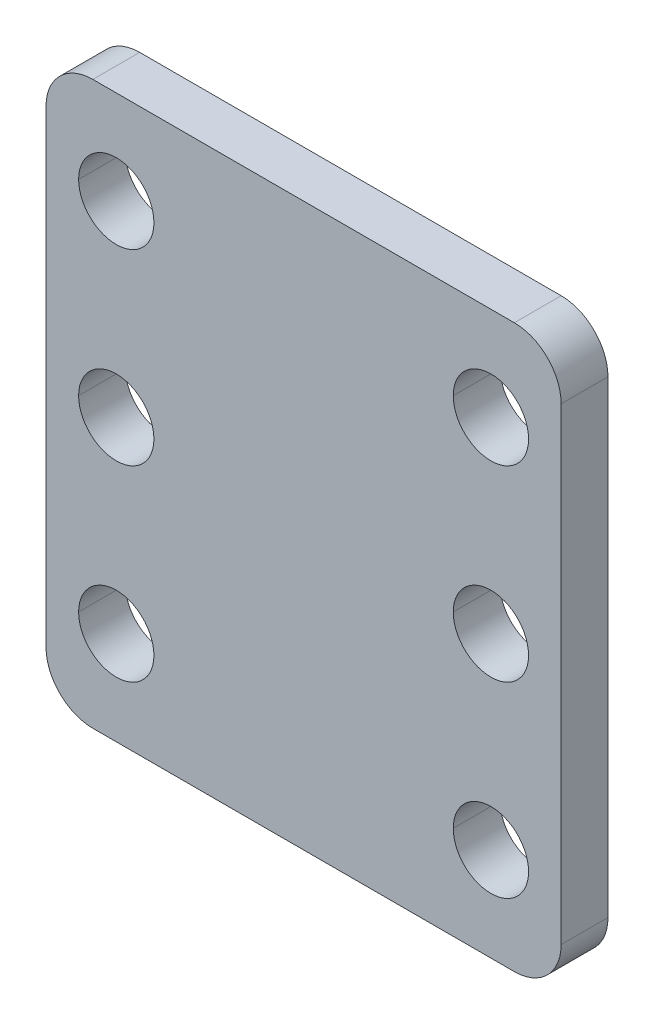
ISO-10303-21;
HEADER;
FILE_DESCRIPTION(('STEP AP214'),'2;1');
FILE_NAME('part.step','',(''),(''),'','','');
FILE_SCHEMA(('AUTOMOTIVE_DESIGN { 1 0 10303 214 1 1 1 1 }'));
ENDSEC;
DATA;
#1=APPLICATION_CONTEXT('core data for automotive mechanical design processes');
#2=APPLICATION_PROTOCOL_DEFINITION('international standard','automotive_design',2000,#1);
#3=PRODUCT_CONTEXT('',#1,'mechanical');
#4=PRODUCT('Part','Part','',(#3));
#5=PRODUCT_RELATED_PRODUCT_CATEGORY('part','',(#4));
#6=PRODUCT_DEFINITION_FORMATION('','',#4);
#7=PRODUCT_DEFINITION_CONTEXT('part definition',#1,'design');
#8=PRODUCT_DEFINITION('design','',#6,#7);
#9=PRODUCT_DEFINITION_SHAPE('','',#8);
#10=(LENGTH_UNIT() NAMED_UNIT(*) SI_UNIT(.MILLI.,.METRE.));
#11=(NAMED_UNIT(*) PLANE_ANGLE_UNIT() SI_UNIT($,.RADIAN.));
#12=(NAMED_UNIT(*) SI_UNIT($,.STERADIAN.) SOLID_ANGLE_UNIT());
#13=UNCERTAINTY_MEASURE_WITH_UNIT(LENGTH_MEASURE(1.E-05),#10,'distance_accuracy_value','');
#14=(GEOMETRIC_REPRESENTATION_CONTEXT(3) GLOBAL_UNCERTAINTY_ASSIGNED_CONTEXT((#13)) GLOBAL_UNIT_ASSIGNED_CONTEXT((#10,
#11,#12)) REPRESENTATION_CONTEXT('',''));
#15=CARTESIAN_POINT('',(0.,0.,0.));
#16=DIRECTION('',(0.,0.,1.));
#17=DIRECTION('',(1.,0.,0.));
#18=AXIS2_PLACEMENT_3D('',#15,#16,#17);
#19=CARTESIAN_POINT('',(114.299999999998,1193.8,-69.849999999999));
#20=DIRECTION('',(0.,0.,1.));
#21=DIRECTION('',(1.,0.,0.));
#22=AXIS2_PLACEMENT_3D('',#19,#20,#21);
#23=CYLINDRICAL_SURFACE('',#22,2.5527);
#24=CARTESIAN_POINT('',(114.299999999998,1193.8,-73.024999999999));
#25=DIRECTION('',(0.,0.,1.));
#26=DIRECTION('',(1.,0.,0.));
#27=AXIS2_PLACEMENT_3D('',#24,#25,#26);
#28=CIRCLE('',#27,2.5527);
#29=CARTESIAN_POINT('',(111.747299999998,1193.8,-73.024999999999));
#30=VERTEX_POINT('',#29);
#31=CARTESIAN_POINT('',(116.852699999998,1193.8,-73.024999999999));
#32=VERTEX_POINT('',#31);
#33=EDGE_CURVE('E208',#30,#32,#28,.F.);
#34=ORIENTED_EDGE('',*,*,#33,.F.);
#35=DIRECTION('',(0.,0.,1.));
#36=VECTOR('',#35,1.);
#37=CARTESIAN_POINT('',(111.747299999998,1193.8,-69.849999999999));
#38=LINE('',#37,#36);
#39=CARTESIAN_POINT('',(111.747299999998,1193.8,-76.199999999999));
#40=VERTEX_POINT('',#39);
#41=EDGE_CURVE('E215',#40,#30,#38,.T.);
#42=ORIENTED_EDGE('',*,*,#41,.F.);
#43=CARTESIAN_POINT('',(114.299999999998,1193.8,-76.199999999999));
#44=DIRECTION('',(0.,0.,1.));
#45=DIRECTION('',(1.,0.,0.));
#46=AXIS2_PLACEMENT_3D('',#43,#44,#45);
#47=CIRCLE('',#46,2.5527);
#48=CARTESIAN_POINT('',(116.852699999998,1193.8,-76.199999999999));
#49=VERTEX_POINT('',#48);
#50=EDGE_CURVE('E256',#49,#40,#47,.T.);
#51=ORIENTED_EDGE('',*,*,#50,.F.);
#52=DIRECTION('',(0.,0.,1.));
#53=VECTOR('',#52,1.);
#54=CARTESIAN_POINT('',(116.852699999998,1193.8,-69.849999999999));
#55=LINE('',#54,#53);
#56=EDGE_CURVE('E217',#49,#32,#55,.T.);
#57=ORIENTED_EDGE('',*,*,#56,.T.);
#58=EDGE_LOOP('',(#34,#42,#51,#57));
#59=FACE_BOUND('',#58,.T.);
#60=ADVANCED_FACE('F50',(#59),#23,.F.);
#61=CARTESIAN_POINT('',(114.299999999998,1168.4,-69.849999999999));
#62=DIRECTION('',(0.,0.,1.));
#63=DIRECTION('',(1.,0.,0.));
#64=AXIS2_PLACEMENT_3D('',#61,#62,#63);
#65=CYLINDRICAL_SURFACE('',#64,2.5527);
#66=CARTESIAN_POINT('',(114.299999999998,1168.4,-73.024999999999));
#67=DIRECTION('',(0.,0.,1.));
#68=DIRECTION('',(1.,0.,0.));
#69=AXIS2_PLACEMENT_3D('',#66,#67,#68);
#70=CIRCLE('',#69,2.5527);
#71=CARTESIAN_POINT('',(111.747299999998,1168.4,-73.024999999999));
#72=VERTEX_POINT('',#71);
#73=CARTESIAN_POINT('',(116.852699999998,1168.4,-73.024999999999));
#74=VERTEX_POINT('',#73);
#75=EDGE_CURVE('E487',#72,#74,#70,.F.);
#76=ORIENTED_EDGE('',*,*,#75,.F.);
#77=DIRECTION('',(0.,0.,1.));
#78=VECTOR('',#77,1.);
#79=CARTESIAN_POINT('',(111.747299999998,1168.4,-69.849999999999));
#80=LINE('',#79,#78);
#81=CARTESIAN_POINT('',(111.747299999998,1168.4,-76.199999999999));
#82=VERTEX_POINT('',#81);
#83=EDGE_CURVE('E288',#82,#72,#80,.T.);
#84=ORIENTED_EDGE('',*,*,#83,.F.);
#85=CARTESIAN_POINT('',(114.299999999998,1168.4,-76.199999999999));
#86=DIRECTION('',(0.,0.,1.));
#87=DIRECTION('',(1.,0.,0.));
#88=AXIS2_PLACEMENT_3D('',#85,#86,#87);
#89=CIRCLE('',#88,2.5527);
#90=CARTESIAN_POINT('',(116.852699999998,1168.4,-76.199999999999));
#91=VERTEX_POINT('',#90);
#92=EDGE_CURVE('E259',#91,#82,#89,.T.);
#93=ORIENTED_EDGE('',*,*,#92,.F.);
#94=DIRECTION('',(0.,0.,1.));
#95=VECTOR('',#94,1.);
#96=CARTESIAN_POINT('',(116.852699999998,1168.4,-69.849999999999));
#97=LINE('',#96,#95);
#98=EDGE_CURVE('E283',#91,#74,#97,.T.);
#99=ORIENTED_EDGE('',*,*,#98,.T.);
#100=EDGE_LOOP('',(#76,#84,#93,#99));
#101=FACE_BOUND('',#100,.T.);
#102=ADVANCED_FACE('F456',(#101),#65,.F.);
#103=CARTESIAN_POINT('',(114.299999999998,1181.1,-69.849999999999));
#104=DIRECTION('',(0.,0.,1.));
#105=DIRECTION('',(1.,0.,0.));
#106=AXIS2_PLACEMENT_3D('',#103,#104,#105);
#107=CYLINDRICAL_SURFACE('',#106,2.5527);
#108=CARTESIAN_POINT('',(114.299999999998,1181.1,-73.024999999999));
#109=DIRECTION('',(0.,0.,1.));
#110=DIRECTION('',(1.,0.,0.));
#111=AXIS2_PLACEMENT_3D('',#108,#109,#110);
#112=CIRCLE('',#111,2.5527);
#113=CARTESIAN_POINT('',(111.747299999998,1181.1,-73.024999999999));
#114=VERTEX_POINT('',#113);
#115=CARTESIAN_POINT('',(116.852699999998,1181.1,-73.024999999999));
#116=VERTEX_POINT('',#115);
#117=EDGE_CURVE('E477',#114,#116,#112,.F.);
#118=ORIENTED_EDGE('',*,*,#117,.F.);
#119=DIRECTION('',(0.,0.,1.));
#120=VECTOR('',#119,1.);
#121=CARTESIAN_POINT('',(111.747299999998,1181.1,-69.849999999999));
#122=LINE('',#121,#120);
#123=CARTESIAN_POINT('',(111.747299999998,1181.1,-76.199999999999));
#124=VERTEX_POINT('',#123);
#125=EDGE_CURVE('E311',#124,#114,#122,.T.);
#126=ORIENTED_EDGE('',*,*,#125,.F.);
#127=CARTESIAN_POINT('',(114.299999999998,1181.1,-76.199999999999));
#128=DIRECTION('',(0.,0.,1.));
#129=DIRECTION('',(1.,0.,0.));
#130=AXIS2_PLACEMENT_3D('',#127,#128,#129);
#131=CIRCLE('',#130,2.5527);
#132=CARTESIAN_POINT('',(116.852699999998,1181.1,-76.199999999999));
#133=VERTEX_POINT('',#132);
#134=EDGE_CURVE('E321',#133,#124,#131,.T.);
#135=ORIENTED_EDGE('',*,*,#134,.F.);
#136=DIRECTION('',(0.,0.,1.));
#137=VECTOR('',#136,1.);
#138=CARTESIAN_POINT('',(116.852699999998,1181.1,-69.849999999999));
#139=LINE('',#138,#137);
#140=EDGE_CURVE('E292',#133,#116,#139,.T.);
#141=ORIENTED_EDGE('',*,*,#140,.T.);
#142=EDGE_LOOP('',(#118,#126,#135,#141));
#143=FACE_BOUND('',#142,.T.);
#144=ADVANCED_FACE('F461',(#143),#107,.F.);
#145=CARTESIAN_POINT('',(139.699999999998,1181.1,-69.849999999999));
#146=DIRECTION('',(0.,0.,1.));
#147=DIRECTION('',(1.,0.,0.));
#148=AXIS2_PLACEMENT_3D('',#145,#146,#147);
#149=CYLINDRICAL_SURFACE('',#148,2.5527);
#150=CARTESIAN_POINT('',(139.699999999998,1181.1,-73.024999999999));
#151=DIRECTION('',(0.,0.,1.));
#152=DIRECTION('',(1.,0.,0.));
#153=AXIS2_PLACEMENT_3D('',#150,#151,#152);
#154=CIRCLE('',#153,2.5527);
#155=CARTESIAN_POINT('',(137.147299999998,1181.1,-73.024999999999));
#156=VERTEX_POINT('',#155);
#157=CARTESIAN_POINT('',(142.252699999998,1181.1,-73.024999999999));
#158=VERTEX_POINT('',#157);
#159=EDGE_CURVE('E493',#156,#158,#154,.F.);
#160=ORIENTED_EDGE('',*,*,#159,.F.);
#161=DIRECTION('',(0.,0.,1.));
#162=VECTOR('',#161,1.);
#163=CARTESIAN_POINT('',(137.147299999998,1181.1,-69.849999999999));
#164=LINE('',#163,#162);
#165=CARTESIAN_POINT('',(137.147299999998,1181.1,-76.199999999999));
#166=VERTEX_POINT('',#165);
#167=EDGE_CURVE('E240',#166,#156,#164,.T.);
#168=ORIENTED_EDGE('',*,*,#167,.F.);
#169=CARTESIAN_POINT('',(139.699999999998,1181.1,-76.199999999999));
#170=DIRECTION('',(0.,0.,1.));
#171=DIRECTION('',(1.,0.,0.));
#172=AXIS2_PLACEMENT_3D('',#169,#170,#171);
#173=CIRCLE('',#172,2.5527);
#174=CARTESIAN_POINT('',(142.252699999998,1181.1,-76.199999999999));
#175=VERTEX_POINT('',#174);
#176=EDGE_CURVE('E269',#175,#166,#173,.T.);
#177=ORIENTED_EDGE('',*,*,#176,.F.);
#178=DIRECTION('',(0.,0.,1.));
#179=VECTOR('',#178,1.);
#180=CARTESIAN_POINT('',(142.252699999998,1181.1,-69.849999999999));
#181=LINE('',#180,#179);
#182=EDGE_CURVE('E243',#175,#158,#181,.T.);
#183=ORIENTED_EDGE('',*,*,#182,.T.);
#184=EDGE_LOOP('',(#160,#168,#177,#183));
#185=FACE_BOUND('',#184,.T.);
#186=ADVANCED_FACE('F468',(#185),#149,.F.);
#187=CARTESIAN_POINT('',(139.699999999998,1193.8,-69.849999999999));
#188=DIRECTION('',(0.,0.,1.));
#189=DIRECTION('',(1.,0.,0.));
#190=AXIS2_PLACEMENT_3D('',#187,#188,#189);
#191=CYLINDRICAL_SURFACE('',#190,2.5527);
#192=CARTESIAN_POINT('',(139.699999999998,1193.8,-73.024999999999));
#193=DIRECTION('',(0.,0.,1.));
#194=DIRECTION('',(1.,0.,0.));
#195=AXIS2_PLACEMENT_3D('',#192,#193,#194);
#196=CIRCLE('',#195,2.5527);
#197=CARTESIAN_POINT('',(137.147299999998,1193.8,-73.024999999999));
#198=VERTEX_POINT('',#197);
#199=CARTESIAN_POINT('',(142.252699999998,1193.8,-73.024999999999));
#200=VERTEX_POINT('',#199);
#201=EDGE_CURVE('E498',#198,#200,#196,.F.);
#202=ORIENTED_EDGE('',*,*,#201,.F.);
#203=DIRECTION('',(0.,0.,1.));
#204=VECTOR('',#203,1.);
#205=CARTESIAN_POINT('',(137.147299999998,1193.8,-69.849999999999));
#206=LINE('',#205,#204);
#207=CARTESIAN_POINT('',(137.147299999998,1193.8,-76.199999999999));
#208=VERTEX_POINT('',#207);
#209=EDGE_CURVE('E296',#208,#198,#206,.T.);
#210=ORIENTED_EDGE('',*,*,#209,.F.);
#211=CARTESIAN_POINT('',(139.699999999998,1193.8,-76.199999999999));
#212=DIRECTION('',(0.,0.,1.));
#213=DIRECTION('',(1.,0.,0.));
#214=AXIS2_PLACEMENT_3D('',#211,#212,#213);
#215=CIRCLE('',#214,2.5527);
#216=CARTESIAN_POINT('',(142.252699999998,1193.8,-76.199999999999));
#217=VERTEX_POINT('',#216);
#218=EDGE_CURVE('E266',#217,#208,#215,.T.);
#219=ORIENTED_EDGE('',*,*,#218,.F.);
#220=DIRECTION('',(0.,0.,1.));
#221=VECTOR('',#220,1.);
#222=CARTESIAN_POINT('',(142.252699999998,1193.8,-69.849999999999));
#223=LINE('',#222,#221);
#224=EDGE_CURVE('E274',#217,#200,#223,.T.);
#225=ORIENTED_EDGE('',*,*,#224,.T.);
#226=EDGE_LOOP('',(#202,#210,#219,#225));
#227=FACE_BOUND('',#226,.T.);
#228=ADVANCED_FACE('F473',(#227),#191,.F.);
#229=CARTESIAN_POINT('',(139.699999999998,1168.4,-69.849999999999));
#230=DIRECTION('',(0.,0.,1.));
#231=DIRECTION('',(1.,0.,0.));
#232=AXIS2_PLACEMENT_3D('',#229,#230,#231);
#233=CYLINDRICAL_SURFACE('',#232,2.5527);
#234=CARTESIAN_POINT('',(139.699999999998,1168.4,-73.024999999999));
#235=DIRECTION('',(0.,0.,1.));
#236=DIRECTION('',(1.,0.,0.));
#237=AXIS2_PLACEMENT_3D('',#234,#235,#236);
#238=CIRCLE('',#237,2.5527);
#239=CARTESIAN_POINT('',(137.147299999998,1168.4,-73.024999999999));
#240=VERTEX_POINT('',#239);
#241=CARTESIAN_POINT('',(142.252699999998,1168.4,-73.024999999999));
#242=VERTEX_POINT('',#241);
#243=EDGE_CURVE('E72',#240,#242,#238,.F.);
#244=ORIENTED_EDGE('',*,*,#243,.F.);
#245=DIRECTION('',(0.,0.,1.));
#246=VECTOR('',#245,1.);
#247=CARTESIAN_POINT('',(137.147299999998,1168.4,-69.849999999999));
#248=LINE('',#247,#246);
#249=CARTESIAN_POINT('',(137.147299999998,1168.4,-76.199999999999));
#250=VERTEX_POINT('',#249);
#251=EDGE_CURVE('E273',#250,#240,#248,.T.);
#252=ORIENTED_EDGE('',*,*,#251,.F.);
#253=CARTESIAN_POINT('',(139.699999999998,1168.4,-76.199999999999));
#254=DIRECTION('',(0.,0.,1.));
#255=DIRECTION('',(1.,0.,0.));
#256=AXIS2_PLACEMENT_3D('',#253,#254,#255);
#257=CIRCLE('',#256,2.5527);
#258=CARTESIAN_POINT('',(142.252699999998,1168.4,-76.199999999999));
#259=VERTEX_POINT('',#258);
#260=EDGE_CURVE('E58',#259,#250,#257,.T.);
#261=ORIENTED_EDGE('',*,*,#260,.F.);
#262=DIRECTION('',(0.,0.,1.));
#263=VECTOR('',#262,1.);
#264=CARTESIAN_POINT('',(142.252699999998,1168.4,-69.849999999999));
#265=LINE('',#264,#263);
#266=EDGE_CURVE('E255',#259,#242,#265,.T.);
#267=ORIENTED_EDGE('',*,*,#266,.T.);
#268=EDGE_LOOP('',(#244,#252,#261,#267));
#269=FACE_BOUND('',#268,.T.);
#270=ADVANCED_FACE('F404',(#269),#233,.F.);
#271=CARTESIAN_POINT('',(141.287499999998,1196.975,-69.849999999999));
#272=DIRECTION('',(0.,0.,-1.));
#273=DIRECTION('',(-1.,0.,0.));
#274=AXIS2_PLACEMENT_3D('',#271,#272,#273);
#275=CYLINDRICAL_SURFACE('',#274,3.175);
#276=DIRECTION('',(0.,0.,-1.));
#277=VECTOR('',#276,1.);
#278=CARTESIAN_POINT('',(141.287499999998,1200.15,-69.849999999999));
#279=LINE('',#278,#277);
#280=CARTESIAN_POINT('',(141.287499999998,1200.15,-73.024999999999));
#281=VERTEX_POINT('',#280);
#282=CARTESIAN_POINT('',(141.287499999998,1200.15,-76.199999999999));
#283=VERTEX_POINT('',#282);
#284=EDGE_CURVE('E261',#281,#283,#279,.T.);
#285=ORIENTED_EDGE('',*,*,#284,.F.);
#286=CARTESIAN_POINT('',(141.287499999998,1196.975,-73.024999999999));
#287=DIRECTION('',(0.,0.,1.));
#288=DIRECTION('',(1.,0.,0.));
#289=AXIS2_PLACEMENT_3D('',#286,#287,#288);
#290=CIRCLE('',#289,3.175);
#291=CARTESIAN_POINT('',(144.462499999998,1196.975,-73.024999999999));
#292=VERTEX_POINT('',#291);
#293=EDGE_CURVE('E374',#281,#292,#290,.F.);
#294=ORIENTED_EDGE('',*,*,#293,.T.);
#295=DIRECTION('',(0.,0.,1.));
#296=VECTOR('',#295,1.);
#297=CARTESIAN_POINT('',(144.462499999998,1196.975,-69.849999999999));
#298=LINE('',#297,#296);
#299=CARTESIAN_POINT('',(144.462499999998,1196.975,-76.199999999999));
#300=VERTEX_POINT('',#299);
#301=EDGE_CURVE('E238',#300,#292,#298,.T.);
#302=ORIENTED_EDGE('',*,*,#301,.F.);
#303=CARTESIAN_POINT('',(141.287499999998,1196.975,-76.199999999999));
#304=DIRECTION('',(0.,0.,-1.));
#305=DIRECTION('',(-1.,0.,0.));
#306=AXIS2_PLACEMENT_3D('',#303,#304,#305);
#307=CIRCLE('',#306,3.175);
#308=EDGE_CURVE('E260',#283,#300,#307,.T.);
#309=ORIENTED_EDGE('',*,*,#308,.F.);
#310=EDGE_LOOP('',(#285,#294,#302,#309));
#311=FACE_BOUND('',#310,.T.);
#312=ADVANCED_FACE('F373',(#311),#275,.T.);
#313=CARTESIAN_POINT('',(112.712499999998,1196.975,-69.849999999999));
#314=DIRECTION('',(0.,0.,-1.));
#315=DIRECTION('',(-1.,0.,0.));
#316=AXIS2_PLACEMENT_3D('',#313,#314,#315);
#317=CYLINDRICAL_SURFACE('',#316,3.175);
#318=DIRECTION('',(0.,0.,-1.));
#319=VECTOR('',#318,1.);
#320=CARTESIAN_POINT('',(109.537499999998,1196.975,-69.849999999999));
#321=LINE('',#320,#319);
#322=CARTESIAN_POINT('',(109.537499999998,1196.975,-73.024999999999));
#323=VERTEX_POINT('',#322);
#324=CARTESIAN_POINT('',(109.537499999998,1196.975,-76.199999999999));
#325=VERTEX_POINT('',#324);
#326=EDGE_CURVE('E249',#323,#325,#321,.T.);
#327=ORIENTED_EDGE('',*,*,#326,.F.);
#328=CARTESIAN_POINT('',(112.712499999998,1196.975,-73.024999999999));
#329=DIRECTION('',(0.,0.,1.));
#330=DIRECTION('',(1.,0.,0.));
#331=AXIS2_PLACEMENT_3D('',#328,#329,#330);
#332=CIRCLE('',#331,3.175);
#333=CARTESIAN_POINT('',(112.712499999998,1200.15,-73.024999999999));
#334=VERTEX_POINT('',#333);
#335=EDGE_CURVE('E388',#323,#334,#332,.F.);
#336=ORIENTED_EDGE('',*,*,#335,.T.);
#337=DIRECTION('',(0.,0.,1.));
#338=VECTOR('',#337,1.);
#339=CARTESIAN_POINT('',(112.712499999998,1200.15,-69.849999999999));
#340=LINE('',#339,#338);
#341=CARTESIAN_POINT('',(112.712499999998,1200.15,-76.199999999999));
#342=VERTEX_POINT('',#341);
#343=EDGE_CURVE('E265',#342,#334,#340,.T.);
#344=ORIENTED_EDGE('',*,*,#343,.F.);
#345=CARTESIAN_POINT('',(112.712499999998,1196.975,-76.199999999999));
#346=DIRECTION('',(0.,0.,-1.));
#347=DIRECTION('',(-1.,0.,0.));
#348=AXIS2_PLACEMENT_3D('',#345,#346,#347);
#349=CIRCLE('',#348,3.175);
#350=EDGE_CURVE('E282',#325,#342,#349,.T.);
#351=ORIENTED_EDGE('',*,*,#350,.F.);
#352=EDGE_LOOP('',(#327,#336,#344,#351));
#353=FACE_BOUND('',#352,.T.);
#354=ADVANCED_FACE('F431',(#353),#317,.T.);
#355=CARTESIAN_POINT('',(112.712499999998,1165.225,-69.849999999999));
#356=DIRECTION('',(0.,0.,-1.));
#357=DIRECTION('',(-1.,0.,0.));
#358=AXIS2_PLACEMENT_3D('',#355,#356,#357);
#359=CYLINDRICAL_SURFACE('',#358,3.175);
#360=DIRECTION('',(0.,0.,-1.));
#361=VECTOR('',#360,1.);
#362=CARTESIAN_POINT('',(112.712499999998,1162.05,-69.849999999999));
#363=LINE('',#362,#361);
#364=CARTESIAN_POINT('',(112.712499999998,1162.05,-73.024999999999));
#365=VERTEX_POINT('',#364);
#366=CARTESIAN_POINT('',(112.712499999998,1162.05,-76.199999999999));
#367=VERTEX_POINT('',#366);
#368=EDGE_CURVE('E279',#365,#367,#363,.T.);
#369=ORIENTED_EDGE('',*,*,#368,.F.);
#370=CARTESIAN_POINT('',(112.712499999998,1165.225,-73.024999999999));
#371=DIRECTION('',(0.,0.,1.));
#372=DIRECTION('',(1.,0.,0.));
#373=AXIS2_PLACEMENT_3D('',#370,#371,#372);
#374=CIRCLE('',#373,3.175);
#375=CARTESIAN_POINT('',(109.537499999998,1165.225,-73.024999999999));
#376=VERTEX_POINT('',#375);
#377=EDGE_CURVE('E385',#365,#376,#374,.F.);
#378=ORIENTED_EDGE('',*,*,#377,.T.);
#379=DIRECTION('',(0.,0.,1.));
#380=VECTOR('',#379,1.);
#381=CARTESIAN_POINT('',(109.537499999998,1165.225,-69.849999999999));
#382=LINE('',#381,#380);
#383=CARTESIAN_POINT('',(109.537499999998,1165.225,-76.199999999999));
#384=VERTEX_POINT('',#383);
#385=EDGE_CURVE('E303',#384,#376,#382,.T.);
#386=ORIENTED_EDGE('',*,*,#385,.F.);
#387=CARTESIAN_POINT('',(112.712499999998,1165.225,-76.199999999999));
#388=DIRECTION('',(0.,0.,-1.));
#389=DIRECTION('',(-1.,0.,0.));
#390=AXIS2_PLACEMENT_3D('',#387,#388,#389);
#391=CIRCLE('',#390,3.175);
#392=EDGE_CURVE('E318',#367,#384,#391,.T.);
#393=ORIENTED_EDGE('',*,*,#392,.F.);
#394=EDGE_LOOP('',(#369,#378,#386,#393));
#395=FACE_BOUND('',#394,.T.);
#396=ADVANCED_FACE('F439',(#395),#359,.T.);
#397=CARTESIAN_POINT('',(141.287499999998,1165.225,-69.849999999999));
#398=DIRECTION('',(0.,0.,-1.));
#399=DIRECTION('',(-1.,0.,0.));
#400=AXIS2_PLACEMENT_3D('',#397,#398,#399);
#401=CYLINDRICAL_SURFACE('',#400,3.175);
#402=DIRECTION('',(0.,0.,-1.));
#403=VECTOR('',#402,1.);
#404=CARTESIAN_POINT('',(144.462499999998,1165.225,-69.849999999999));
#405=LINE('',#404,#403);
#406=CARTESIAN_POINT('',(144.462499999998,1165.225,-73.024999999999));
#407=VERTEX_POINT('',#406);
#408=CARTESIAN_POINT('',(144.462499999998,1165.225,-76.199999999999));
#409=VERTEX_POINT('',#408);
#410=EDGE_CURVE('E251',#407,#409,#405,.T.);
#411=ORIENTED_EDGE('',*,*,#410,.F.);
#412=CARTESIAN_POINT('',(141.287499999998,1165.225,-73.024999999999));
#413=DIRECTION('',(0.,0.,1.));
#414=DIRECTION('',(1.,0.,0.));
#415=AXIS2_PLACEMENT_3D('',#412,#413,#414);
#416=CIRCLE('',#415,3.175);
#417=CARTESIAN_POINT('',(141.287499999998,1162.05,-73.024999999999));
#418=VERTEX_POINT('',#417);
#419=EDGE_CURVE('E65',#407,#418,#416,.F.);
#420=ORIENTED_EDGE('',*,*,#419,.T.);
#421=DIRECTION('',(0.,0.,1.));
#422=VECTOR('',#421,1.);
#423=CARTESIAN_POINT('',(141.287499999998,1162.05,-69.849999999999));
#424=LINE('',#423,#422);
#425=CARTESIAN_POINT('',(141.287499999998,1162.05,-76.199999999999));
#426=VERTEX_POINT('',#425);
#427=EDGE_CURVE('E248',#426,#418,#424,.T.);
#428=ORIENTED_EDGE('',*,*,#427,.F.);
#429=CARTESIAN_POINT('',(141.287499999998,1165.225,-76.199999999999));
#430=DIRECTION('',(0.,0.,-1.));
#431=DIRECTION('',(-1.,0.,0.));
#432=AXIS2_PLACEMENT_3D('',#429,#430,#431);
#433=CIRCLE('',#432,3.175);
#434=EDGE_CURVE('E315',#409,#426,#433,.T.);
#435=ORIENTED_EDGE('',*,*,#434,.F.);
#436=EDGE_LOOP('',(#411,#420,#428,#435));
#437=FACE_BOUND('',#436,.T.);
#438=ADVANCED_FACE('F444',(#437),#401,.T.);
#439=CARTESIAN_POINT('',(109.537499999998,1162.05,-69.849999999999));
#440=DIRECTION('',(0.,1.,0.));
#441=DIRECTION('',(1.,0.,0.));
#442=AXIS2_PLACEMENT_3D('',#439,#440,#441);
#443=PLANE('',#442);
#444=DIRECTION('',(1.,0.,0.));
#445=VECTOR('',#444,1.);
#446=CARTESIAN_POINT('',(109.537499999998,1162.05,-73.024999999999));
#447=LINE('',#446,#445);
#448=EDGE_CURVE('E378',#365,#418,#447,.T.);
#449=ORIENTED_EDGE('',*,*,#448,.F.);
#450=ORIENTED_EDGE('',*,*,#368,.T.);
#451=DIRECTION('',(1.,0.,0.));
#452=VECTOR('',#451,1.);
#453=CARTESIAN_POINT('',(109.537499999998,1162.05,-76.199999999999));
#454=LINE('',#453,#452);
#455=EDGE_CURVE('E245',#367,#426,#454,.T.);
#456=ORIENTED_EDGE('',*,*,#455,.T.);
#457=ORIENTED_EDGE('',*,*,#427,.T.);
#458=EDGE_LOOP('',(#449,#450,#456,#457));
#459=FACE_BOUND('',#458,.T.);
#460=ADVANCED_FACE('F442',(#459),#443,.F.);
#461=CARTESIAN_POINT('',(109.537499999998,1162.05,-69.849999999999));
#462=DIRECTION('',(1.,0.,0.));
#463=DIRECTION('',(0.,1.,0.));
#464=AXIS2_PLACEMENT_3D('',#461,#462,#463);
#465=PLANE('',#464);
#466=DIRECTION('',(0.,-1.,0.));
#467=VECTOR('',#466,1.);
#468=CARTESIAN_POINT('',(109.537499999998,1162.05,-73.024999999999));
#469=LINE('',#468,#467);
#470=EDGE_CURVE('E234',#323,#376,#469,.T.);
#471=ORIENTED_EDGE('',*,*,#470,.F.);
#472=ORIENTED_EDGE('',*,*,#326,.T.);
#473=DIRECTION('',(0.,-1.,0.));
#474=VECTOR('',#473,1.);
#475=CARTESIAN_POINT('',(109.537499999998,1162.05,-76.199999999999));
#476=LINE('',#475,#474);
#477=EDGE_CURVE('E264',#325,#384,#476,.T.);
#478=ORIENTED_EDGE('',*,*,#477,.T.);
#479=ORIENTED_EDGE('',*,*,#385,.T.);
#480=EDGE_LOOP('',(#471,#472,#478,#479));
#481=FACE_BOUND('',#480,.T.);
#482=ADVANCED_FACE('F434',(#481),#465,.F.);
#483=CARTESIAN_POINT('',(109.537499999998,1200.15,-69.849999999999));
#484=DIRECTION('',(0.,-1.,0.));
#485=DIRECTION('',(0.,0.,-1.));
#486=AXIS2_PLACEMENT_3D('',#483,#484,#485);
#487=PLANE('',#486);
#488=DIRECTION('',(-1.,0.,0.));
#489=VECTOR('',#488,1.);
#490=CARTESIAN_POINT('',(109.537499999998,1200.15,-73.024999999999));
#491=LINE('',#490,#489);
#492=EDGE_CURVE('E376',#281,#334,#491,.T.);
#493=ORIENTED_EDGE('',*,*,#492,.F.);
#494=ORIENTED_EDGE('',*,*,#284,.T.);
#495=DIRECTION('',(-1.,0.,0.));
#496=VECTOR('',#495,1.);
#497=CARTESIAN_POINT('',(109.537499999998,1200.15,-76.199999999999));
#498=LINE('',#497,#496);
#499=EDGE_CURVE('E307',#283,#342,#498,.T.);
#500=ORIENTED_EDGE('',*,*,#499,.T.);
#501=ORIENTED_EDGE('',*,*,#343,.T.);
#502=EDGE_LOOP('',(#493,#494,#500,#501));
#503=FACE_BOUND('',#502,.T.);
#504=ADVANCED_FACE('F52',(#503),#487,.F.);
#505=CARTESIAN_POINT('',(144.462499999998,1162.05,-69.849999999999));
#506=DIRECTION('',(-1.,0.,0.));
#507=DIRECTION('',(0.,0.,1.));
#508=AXIS2_PLACEMENT_3D('',#505,#506,#507);
#509=PLANE('',#508);
#510=DIRECTION('',(0.,1.,0.));
#511=VECTOR('',#510,1.);
#512=CARTESIAN_POINT('',(144.462499999998,1162.05,-73.024999999999));
#513=LINE('',#512,#511);
#514=EDGE_CURVE('E366',#407,#292,#513,.T.);
#515=ORIENTED_EDGE('',*,*,#514,.F.);
#516=ORIENTED_EDGE('',*,*,#410,.T.);
#517=DIRECTION('',(0.,1.,0.));
#518=VECTOR('',#517,1.);
#519=CARTESIAN_POINT('',(144.462499999998,1162.05,-76.199999999999));
#520=LINE('',#519,#518);
#521=EDGE_CURVE('E254',#409,#300,#520,.T.);
#522=ORIENTED_EDGE('',*,*,#521,.T.);
#523=ORIENTED_EDGE('',*,*,#301,.T.);
#524=EDGE_LOOP('',(#515,#516,#522,#523));
#525=FACE_BOUND('',#524,.T.);
#526=ADVANCED_FACE('F365',(#525),#509,.F.);
#527=CARTESIAN_POINT('',(139.699999999998,1168.4,-69.849999999999));
#528=DIRECTION('',(0.,0.,1.));
#529=DIRECTION('',(1.,0.,0.));
#530=AXIS2_PLACEMENT_3D('',#527,#528,#529);
#531=CYLINDRICAL_SURFACE('',#530,2.5527);
#532=CARTESIAN_POINT('',(139.699999999998,1168.4,-73.024999999999));
#533=DIRECTION('',(0.,0.,1.));
#534=DIRECTION('',(1.,0.,0.));
#535=AXIS2_PLACEMENT_3D('',#532,#533,#534);
#536=CIRCLE('',#535,2.5527);
#537=EDGE_CURVE('E409',#242,#240,#536,.F.);
#538=ORIENTED_EDGE('',*,*,#537,.F.);
#539=ORIENTED_EDGE('',*,*,#266,.F.);
#540=CARTESIAN_POINT('',(139.699999999998,1168.4,-76.199999999999));
#541=DIRECTION('',(0.,0.,1.));
#542=DIRECTION('',(1.,0.,0.));
#543=AXIS2_PLACEMENT_3D('',#540,#541,#542);
#544=CIRCLE('',#543,2.5527);
#545=EDGE_CURVE('E270',#250,#259,#544,.T.);
#546=ORIENTED_EDGE('',*,*,#545,.F.);
#547=ORIENTED_EDGE('',*,*,#251,.T.);
#548=EDGE_LOOP('',(#538,#539,#546,#547));
#549=FACE_BOUND('',#548,.T.);
#550=ADVANCED_FACE('F408',(#549),#531,.F.);
#551=CARTESIAN_POINT('',(139.699999999998,1193.8,-69.849999999999));
#552=DIRECTION('',(0.,0.,1.));
#553=DIRECTION('',(1.,0.,0.));
#554=AXIS2_PLACEMENT_3D('',#551,#552,#553);
#555=CYLINDRICAL_SURFACE('',#554,2.5527);
#556=CARTESIAN_POINT('',(139.699999999998,1193.8,-73.024999999999));
#557=DIRECTION('',(0.,0.,1.));
#558=DIRECTION('',(1.,0.,0.));
#559=AXIS2_PLACEMENT_3D('',#556,#557,#558);
#560=CIRCLE('',#559,2.5527);
#561=EDGE_CURVE('E496',#200,#198,#560,.F.);
#562=ORIENTED_EDGE('',*,*,#561,.F.);
#563=ORIENTED_EDGE('',*,*,#224,.F.);
#564=CARTESIAN_POINT('',(139.699999999998,1193.8,-76.199999999999));
#565=DIRECTION('',(0.,0.,1.));
#566=DIRECTION('',(1.,0.,0.));
#567=AXIS2_PLACEMENT_3D('',#564,#565,#566);
#568=CIRCLE('',#567,2.5527);
#569=EDGE_CURVE('E300',#208,#217,#568,.T.);
#570=ORIENTED_EDGE('',*,*,#569,.F.);
#571=ORIENTED_EDGE('',*,*,#209,.T.);
#572=EDGE_LOOP('',(#562,#563,#570,#571));
#573=FACE_BOUND('',#572,.T.);
#574=ADVANCED_FACE('F561',(#573),#555,.F.);
#575=CARTESIAN_POINT('',(139.699999999998,1181.1,-69.849999999999));
#576=DIRECTION('',(0.,0.,1.));
#577=DIRECTION('',(1.,0.,0.));
#578=AXIS2_PLACEMENT_3D('',#575,#576,#577);
#579=CYLINDRICAL_SURFACE('',#578,2.5527);
#580=CARTESIAN_POINT('',(139.699999999998,1181.1,-73.024999999999));
#581=DIRECTION('',(0.,0.,1.));
#582=DIRECTION('',(1.,0.,0.));
#583=AXIS2_PLACEMENT_3D('',#580,#581,#582);
#584=CIRCLE('',#583,2.5527);
#585=EDGE_CURVE('E482',#158,#156,#584,.F.);
#586=ORIENTED_EDGE('',*,*,#585,.F.);
#587=ORIENTED_EDGE('',*,*,#182,.F.);
#588=CARTESIAN_POINT('',(139.699999999998,1181.1,-76.199999999999));
#589=DIRECTION('',(0.,0.,1.));
#590=DIRECTION('',(1.,0.,0.));
#591=AXIS2_PLACEMENT_3D('',#588,#589,#590);
#592=CIRCLE('',#591,2.5527);
#593=EDGE_CURVE('E244',#166,#175,#592,.T.);
#594=ORIENTED_EDGE('',*,*,#593,.F.);
#595=ORIENTED_EDGE('',*,*,#167,.T.);
#596=EDGE_LOOP('',(#586,#587,#594,#595));
#597=FACE_BOUND('',#596,.T.);
#598=ADVANCED_FACE('F552',(#597),#579,.F.);
#599=CARTESIAN_POINT('',(114.299999999998,1181.1,-69.849999999999));
#600=DIRECTION('',(0.,0.,1.));
#601=DIRECTION('',(1.,0.,0.));
#602=AXIS2_PLACEMENT_3D('',#599,#600,#601);
#603=CYLINDRICAL_SURFACE('',#602,2.5527);
#604=CARTESIAN_POINT('',(114.299999999998,1181.1,-73.024999999999));
#605=DIRECTION('',(0.,0.,1.));
#606=DIRECTION('',(1.,0.,0.));
#607=AXIS2_PLACEMENT_3D('',#604,#605,#606);
#608=CIRCLE('',#607,2.5527);
#609=EDGE_CURVE('E483',#116,#114,#608,.F.);
#610=ORIENTED_EDGE('',*,*,#609,.F.);
#611=ORIENTED_EDGE('',*,*,#140,.F.);
#612=CARTESIAN_POINT('',(114.299999999998,1181.1,-76.199999999999));
#613=DIRECTION('',(0.,0.,1.));
#614=DIRECTION('',(1.,0.,0.));
#615=AXIS2_PLACEMENT_3D('',#612,#613,#614);
#616=CIRCLE('',#615,2.5527);
#617=EDGE_CURVE('E287',#124,#133,#616,.T.);
#618=ORIENTED_EDGE('',*,*,#617,.F.);
#619=ORIENTED_EDGE('',*,*,#125,.T.);
#620=EDGE_LOOP('',(#610,#611,#618,#619));
#621=FACE_BOUND('',#620,.T.);
#622=ADVANCED_FACE('F486',(#621),#603,.F.);
#623=CARTESIAN_POINT('',(114.299999999998,1168.4,-69.849999999999));
#624=DIRECTION('',(0.,0.,1.));
#625=DIRECTION('',(1.,0.,0.));
#626=AXIS2_PLACEMENT_3D('',#623,#624,#625);
#627=CYLINDRICAL_SURFACE('',#626,2.5527);
#628=CARTESIAN_POINT('',(114.299999999998,1168.4,-73.024999999999));
#629=DIRECTION('',(0.,0.,1.));
#630=DIRECTION('',(1.,0.,0.));
#631=AXIS2_PLACEMENT_3D('',#628,#629,#630);
#632=CIRCLE('',#631,2.5527);
#633=EDGE_CURVE('E219',#74,#72,#632,.F.);
#634=ORIENTED_EDGE('',*,*,#633,.F.);
#635=ORIENTED_EDGE('',*,*,#98,.F.);
#636=CARTESIAN_POINT('',(114.299999999998,1168.4,-76.199999999999));
#637=DIRECTION('',(0.,0.,1.));
#638=DIRECTION('',(1.,0.,0.));
#639=AXIS2_PLACEMENT_3D('',#636,#637,#638);
#640=CIRCLE('',#639,2.5527);
#641=EDGE_CURVE('E231',#82,#91,#640,.T.);
#642=ORIENTED_EDGE('',*,*,#641,.F.);
#643=ORIENTED_EDGE('',*,*,#83,.T.);
#644=EDGE_LOOP('',(#634,#635,#642,#643));
#645=FACE_BOUND('',#644,.T.);
#646=ADVANCED_FACE('F537',(#645),#627,.F.);
#647=CARTESIAN_POINT('',(114.299999999998,1193.8,-69.849999999999));
#648=DIRECTION('',(0.,0.,1.));
#649=DIRECTION('',(1.,0.,0.));
#650=AXIS2_PLACEMENT_3D('',#647,#648,#649);
#651=CYLINDRICAL_SURFACE('',#650,2.5527);
#652=CARTESIAN_POINT('',(114.299999999998,1193.8,-73.024999999999));
#653=DIRECTION('',(0.,0.,1.));
#654=DIRECTION('',(1.,0.,0.));
#655=AXIS2_PLACEMENT_3D('',#652,#653,#654);
#656=CIRCLE('',#655,2.5527);
#657=EDGE_CURVE('E11',#32,#30,#656,.F.);
#658=ORIENTED_EDGE('',*,*,#657,.F.);
#659=ORIENTED_EDGE('',*,*,#56,.F.);
#660=CARTESIAN_POINT('',(114.299999999998,1193.8,-76.199999999999));
#661=DIRECTION('',(0.,0.,1.));
#662=DIRECTION('',(1.,0.,0.));
#663=AXIS2_PLACEMENT_3D('',#660,#661,#662);
#664=CIRCLE('',#663,2.5527);
#665=EDGE_CURVE('E223',#40,#49,#664,.T.);
#666=ORIENTED_EDGE('',*,*,#665,.F.);
#667=ORIENTED_EDGE('',*,*,#41,.T.);
#668=EDGE_LOOP('',(#658,#659,#666,#667));
#669=FACE_BOUND('',#668,.T.);
#670=ADVANCED_FACE('F221',(#669),#651,.F.);
#671=CARTESIAN_POINT('',(126.999999999998,1181.1,-76.199999999999));
#672=DIRECTION('',(0.,0.,-1.));
#673=DIRECTION('',(0.,-1.,0.));
#674=AXIS2_PLACEMENT_3D('',#671,#672,#673);
#675=PLANE('',#674);
#676=ORIENTED_EDGE('',*,*,#260,.T.);
#677=ORIENTED_EDGE('',*,*,#545,.T.);
#678=EDGE_LOOP('',(#676,#677));
#679=FACE_BOUND('',#678,.T.);
#680=ORIENTED_EDGE('',*,*,#218,.T.);
#681=ORIENTED_EDGE('',*,*,#569,.T.);
#682=EDGE_LOOP('',(#680,#681));
#683=FACE_BOUND('',#682,.T.);
#684=ORIENTED_EDGE('',*,*,#176,.T.);
#685=ORIENTED_EDGE('',*,*,#593,.T.);
#686=EDGE_LOOP('',(#684,#685));
#687=FACE_BOUND('',#686,.T.);
#688=ORIENTED_EDGE('',*,*,#134,.T.);
#689=ORIENTED_EDGE('',*,*,#617,.T.);
#690=EDGE_LOOP('',(#688,#689));
#691=FACE_BOUND('',#690,.T.);
#692=ORIENTED_EDGE('',*,*,#92,.T.);
#693=ORIENTED_EDGE('',*,*,#641,.T.);
#694=EDGE_LOOP('',(#692,#693));
#695=FACE_BOUND('',#694,.T.);
#696=ORIENTED_EDGE('',*,*,#50,.T.);
#697=ORIENTED_EDGE('',*,*,#665,.T.);
#698=EDGE_LOOP('',(#696,#697));
#699=FACE_BOUND('',#698,.T.);
#700=ORIENTED_EDGE('',*,*,#521,.F.);
#701=ORIENTED_EDGE('',*,*,#434,.T.);
#702=ORIENTED_EDGE('',*,*,#455,.F.);
#703=ORIENTED_EDGE('',*,*,#392,.T.);
#704=ORIENTED_EDGE('',*,*,#477,.F.);
#705=ORIENTED_EDGE('',*,*,#350,.T.);
#706=ORIENTED_EDGE('',*,*,#499,.F.);
#707=ORIENTED_EDGE('',*,*,#308,.T.);
#708=EDGE_LOOP('',(#700,#701,#702,#703,#704,#705,#706,#707));
#709=FACE_BOUND('',#708,.T.);
#710=ADVANCED_FACE('F411',(#679,#683,#687,#691,#695,#699,#709),#675,.T.);
#711=CARTESIAN_POINT('',(125.441340683039,1181.34404911402,-73.024999999999));
#712=DIRECTION('',(0.,0.,1.));
#713=DIRECTION('',(1.,0.,0.));
#714=AXIS2_PLACEMENT_3D('',#711,#712,#713);
#715=PLANE('',#714);
#716=ORIENTED_EDGE('',*,*,#243,.T.);
#717=ORIENTED_EDGE('',*,*,#537,.T.);
#718=EDGE_LOOP('',(#716,#717));
#719=FACE_BOUND('',#718,.T.);
#720=ORIENTED_EDGE('',*,*,#159,.T.);
#721=ORIENTED_EDGE('',*,*,#585,.T.);
#722=EDGE_LOOP('',(#720,#721));
#723=FACE_BOUND('',#722,.T.);
#724=ORIENTED_EDGE('',*,*,#75,.T.);
#725=ORIENTED_EDGE('',*,*,#633,.T.);
#726=EDGE_LOOP('',(#724,#725));
#727=FACE_BOUND('',#726,.T.);
#728=ORIENTED_EDGE('',*,*,#33,.T.);
#729=ORIENTED_EDGE('',*,*,#657,.T.);
#730=EDGE_LOOP('',(#728,#729));
#731=FACE_BOUND('',#730,.T.);
#732=ORIENTED_EDGE('',*,*,#117,.T.);
#733=ORIENTED_EDGE('',*,*,#609,.T.);
#734=EDGE_LOOP('',(#732,#733));
#735=FACE_BOUND('',#734,.T.);
#736=ORIENTED_EDGE('',*,*,#201,.T.);
#737=ORIENTED_EDGE('',*,*,#561,.T.);
#738=EDGE_LOOP('',(#736,#737));
#739=FACE_BOUND('',#738,.T.);
#740=ORIENTED_EDGE('',*,*,#470,.T.);
#741=ORIENTED_EDGE('',*,*,#377,.F.);
#742=ORIENTED_EDGE('',*,*,#448,.T.);
#743=ORIENTED_EDGE('',*,*,#419,.F.);
#744=ORIENTED_EDGE('',*,*,#514,.T.);
#745=ORIENTED_EDGE('',*,*,#293,.F.);
#746=ORIENTED_EDGE('',*,*,#492,.T.);
#747=ORIENTED_EDGE('',*,*,#335,.F.);
#748=EDGE_LOOP('',(#740,#741,#742,#743,#744,#745,#746,#747));
#749=FACE_BOUND('',#748,.T.);
#750=ADVANCED_FACE('F206',(#719,#723,#727,#731,#735,#739,#749),#715,.T.);
#751=CLOSED_SHELL('',(#60,#102,#144,#186,#228,#270,#312,#354,#396,#438,#460,#482,#504,#526,#550,
#574,#598,#622,#646,#670,#710,#750));
#752=MANIFOLD_SOLID_BREP('B2',#751);
#753=ADVANCED_BREP_SHAPE_REPRESENTATION('',(#18,#752),#14);
#754=SHAPE_DEFINITION_REPRESENTATION(#9,#753);
ENDSEC;
END-ISO-10303-21;
